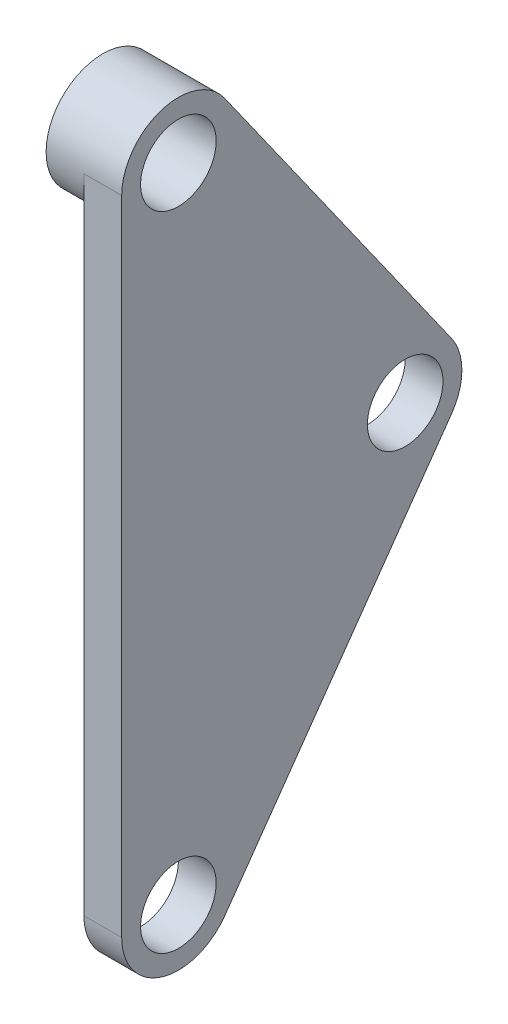
ISO-10303-21;
HEADER;
FILE_DESCRIPTION(('STEP AP214'),'2;1');
FILE_NAME('part.step','',(''),(''),'','','');
FILE_SCHEMA(('AUTOMOTIVE_DESIGN { 1 0 10303 214 1 1 1 1 }'));
ENDSEC;
DATA;
#1=APPLICATION_CONTEXT('core data for automotive mechanical design processes');
#2=APPLICATION_PROTOCOL_DEFINITION('international standard','automotive_design',2000,#1);
#3=PRODUCT_CONTEXT('',#1,'mechanical');
#4=PRODUCT('Part','Part','',(#3));
#5=PRODUCT_RELATED_PRODUCT_CATEGORY('part','',(#4));
#6=PRODUCT_DEFINITION_FORMATION('','',#4);
#7=PRODUCT_DEFINITION_CONTEXT('part definition',#1,'design');
#8=PRODUCT_DEFINITION('design','',#6,#7);
#9=PRODUCT_DEFINITION_SHAPE('','',#8);
#10=(LENGTH_UNIT() NAMED_UNIT(*) SI_UNIT(.MILLI.,.METRE.));
#11=(NAMED_UNIT(*) PLANE_ANGLE_UNIT() SI_UNIT($,.RADIAN.));
#12=(NAMED_UNIT(*) SI_UNIT($,.STERADIAN.) SOLID_ANGLE_UNIT());
#13=UNCERTAINTY_MEASURE_WITH_UNIT(LENGTH_MEASURE(1.E-05),#10,'distance_accuracy_value','');
#14=(GEOMETRIC_REPRESENTATION_CONTEXT(3) GLOBAL_UNCERTAINTY_ASSIGNED_CONTEXT((#13)) GLOBAL_UNIT_ASSIGNED_CONTEXT((#10,
#11,#12)) REPRESENTATION_CONTEXT('',''));
#15=CARTESIAN_POINT('',(0.,0.,0.));
#16=DIRECTION('',(0.,0.,1.));
#17=DIRECTION('',(1.,0.,0.));
#18=AXIS2_PLACEMENT_3D('',#15,#16,#17);
#19=CARTESIAN_POINT('',(2.,2.14575398078673,-3.03981813944787));
#20=DIRECTION('',(0.,0.576683197598655,-0.816967863264762));
#21=DIRECTION('',(0.,0.816967863264762,0.576683197598655));
#22=AXIS2_PLACEMENT_3D('',#19,#20,#21);
#23=PLANE('',#22);
#24=DIRECTION('',(0.,-0.816967863264762,-0.576683197598655));
#25=VECTOR('',#24,1.);
#26=CARTESIAN_POINT('',(0.,2.14575398078673,-3.03981813944787));
#27=LINE('',#26,#25);
#28=CARTESIAN_POINT('',(0.,-1.26995040720403,-5.45090358979429));
#29=VERTEX_POINT('',#28);
#30=CARTESIAN_POINT('',(0.,-18.269950407204,-17.4509035897943));
#31=VERTEX_POINT('',#30);
#32=EDGE_CURVE('E196',#29,#31,#27,.T.);
#33=ORIENTED_EDGE('',*,*,#32,.F.);
#34=DIRECTION('',(-1.,0.,0.));
#35=VECTOR('',#34,1.);
#36=CARTESIAN_POINT('',(2.,-1.26995040720403,-5.45090358979429));
#37=LINE('',#36,#35);
#38=CARTESIAN_POINT('',(2.,-1.26995040720403,-5.45090358979429));
#39=VERTEX_POINT('',#38);
#40=EDGE_CURVE('E211',#39,#29,#37,.T.);
#41=ORIENTED_EDGE('',*,*,#40,.F.);
#42=DIRECTION('',(0.,-0.816967863264762,-0.576683197598655));
#43=VECTOR('',#42,1.);
#44=CARTESIAN_POINT('',(2.,2.14575398078673,-3.03981813944787));
#45=LINE('',#44,#43);
#46=CARTESIAN_POINT('',(2.,-18.269950407204,-17.4509035897943));
#47=VERTEX_POINT('',#46);
#48=EDGE_CURVE('E187',#39,#47,#45,.T.);
#49=ORIENTED_EDGE('',*,*,#48,.T.);
#50=DIRECTION('',(-1.,0.,0.));
#51=VECTOR('',#50,1.);
#52=CARTESIAN_POINT('',(2.,-18.269950407204,-17.4509035897943));
#53=LINE('',#52,#51);
#54=EDGE_CURVE('E115',#47,#31,#53,.T.);
#55=ORIENTED_EDGE('',*,*,#54,.T.);
#56=EDGE_LOOP('',(#33,#41,#49,#55));
#57=FACE_BOUND('',#56,.T.);
#58=ADVANCED_FACE('F104',(#57),#23,.T.);
#59=CARTESIAN_POINT('',(2.,0.,0.));
#60=DIRECTION('',(0.,0.,-1.));
#61=DIRECTION('',(-1.,0.,0.));
#62=AXIS2_PLACEMENT_3D('',#59,#60,#61);
#63=PLANE('',#62);
#64=DIRECTION('',(0.,-1.,0.));
#65=VECTOR('',#64,1.);
#66=CARTESIAN_POINT('',(0.,0.,0.));
#67=LINE('',#66,#65);
#68=CARTESIAN_POINT('',(0.,-3.,0.));
#69=VERTEX_POINT('',#68);
#70=CARTESIAN_POINT('',(0.,-37.,0.));
#71=VERTEX_POINT('',#70);
#72=EDGE_CURVE('E168',#69,#71,#67,.T.);
#73=ORIENTED_EDGE('',*,*,#72,.T.);
#74=DIRECTION('',(-1.,0.,0.));
#75=VECTOR('',#74,1.);
#76=CARTESIAN_POINT('',(2.,-37.,0.));
#77=LINE('',#76,#75);
#78=CARTESIAN_POINT('',(2.,-37.,0.));
#79=VERTEX_POINT('',#78);
#80=EDGE_CURVE('E161',#79,#71,#77,.T.);
#81=ORIENTED_EDGE('',*,*,#80,.F.);
#82=DIRECTION('',(0.,-1.,0.));
#83=VECTOR('',#82,1.);
#84=CARTESIAN_POINT('',(2.,0.,0.));
#85=LINE('',#84,#83);
#86=CARTESIAN_POINT('',(2.,-3.,0.));
#87=VERTEX_POINT('',#86);
#88=EDGE_CURVE('E166',#87,#79,#85,.T.);
#89=ORIENTED_EDGE('',*,*,#88,.F.);
#90=DIRECTION('',(-1.,0.,0.));
#91=VECTOR('',#90,1.);
#92=CARTESIAN_POINT('',(2.,-3.,0.));
#93=LINE('',#92,#91);
#94=EDGE_CURVE('E172',#87,#69,#93,.T.);
#95=ORIENTED_EDGE('',*,*,#94,.T.);
#96=EDGE_LOOP('',(#73,#81,#89,#95));
#97=FACE_BOUND('',#96,.T.);
#98=ADVANCED_FACE('F163',(#97),#63,.F.);
#99=CARTESIAN_POINT('',(2.,-15.4482943964911,-21.8850837283624));
#100=DIRECTION('',(0.,-0.576683197598655,-0.816967863264762));
#101=DIRECTION('',(0.,0.816967863264762,-0.576683197598655));
#102=AXIS2_PLACEMENT_3D('',#99,#100,#101);
#103=PLANE('',#102);
#104=DIRECTION('',(0.,-0.816967863264762,0.576683197598655));
#105=VECTOR('',#104,1.);
#106=CARTESIAN_POINT('',(0.,-15.4482943964911,-21.8850837283624));
#107=LINE('',#106,#105);
#108=CARTESIAN_POINT('',(0.,-21.730049592796,-17.4509035897943));
#109=VERTEX_POINT('',#108);
#110=CARTESIAN_POINT('',(0.,-38.730049592796,-5.45090358979429));
#111=VERTEX_POINT('',#110);
#112=EDGE_CURVE('E193',#109,#111,#107,.T.);
#113=ORIENTED_EDGE('',*,*,#112,.F.);
#114=DIRECTION('',(-1.,0.,0.));
#115=VECTOR('',#114,1.);
#116=CARTESIAN_POINT('',(2.,-21.730049592796,-17.4509035897943));
#117=LINE('',#116,#115);
#118=CARTESIAN_POINT('',(2.,-21.730049592796,-17.4509035897943));
#119=VERTEX_POINT('',#118);
#120=EDGE_CURVE('E124',#119,#109,#117,.T.);
#121=ORIENTED_EDGE('',*,*,#120,.F.);
#122=DIRECTION('',(0.,-0.816967863264762,0.576683197598655));
#123=VECTOR('',#122,1.);
#124=CARTESIAN_POINT('',(2.,-15.4482943964911,-21.8850837283624));
#125=LINE('',#124,#123);
#126=CARTESIAN_POINT('',(2.,-38.730049592796,-5.45090358979429));
#127=VERTEX_POINT('',#126);
#128=EDGE_CURVE('E186',#119,#127,#125,.T.);
#129=ORIENTED_EDGE('',*,*,#128,.T.);
#130=DIRECTION('',(-1.,0.,0.));
#131=VECTOR('',#130,1.);
#132=CARTESIAN_POINT('',(2.,-38.730049592796,-5.45090358979429));
#133=LINE('',#132,#131);
#134=EDGE_CURVE('E141',#127,#111,#133,.T.);
#135=ORIENTED_EDGE('',*,*,#134,.T.);
#136=EDGE_LOOP('',(#113,#121,#129,#135));
#137=FACE_BOUND('',#136,.T.);
#138=ADVANCED_FACE('F229',(#137),#103,.T.);
#139=CARTESIAN_POINT('',(0.,0.,0.));
#140=DIRECTION('',(1.,0.,0.));
#141=DIRECTION('',(0.,0.,-1.));
#142=AXIS2_PLACEMENT_3D('',#139,#140,#141);
#143=PLANE('',#142);
#144=CARTESIAN_POINT('',(0.,-20.,-15.));
#145=DIRECTION('',(1.,0.,0.));
#146=DIRECTION('',(0.,0.,-1.));
#147=AXIS2_PLACEMENT_3D('',#144,#145,#146);
#148=CIRCLE('',#147,2.);
#149=CARTESIAN_POINT('',(0.,-20.,-17.));
#150=VERTEX_POINT('',#149);
#151=EDGE_CURVE('E301',#150,#150,#148,.F.);
#152=ORIENTED_EDGE('',*,*,#151,.F.);
#153=EDGE_LOOP('',(#152));
#154=FACE_BOUND('',#153,.T.);
#155=CARTESIAN_POINT('',(0.,-37.,-3.));
#156=DIRECTION('',(1.,0.,0.));
#157=DIRECTION('',(0.,0.,-1.));
#158=AXIS2_PLACEMENT_3D('',#155,#156,#157);
#159=CIRCLE('',#158,2.);
#160=CARTESIAN_POINT('',(0.,-37.,-5.));
#161=VERTEX_POINT('',#160);
#162=EDGE_CURVE('E289',#161,#161,#159,.F.);
#163=ORIENTED_EDGE('',*,*,#162,.F.);
#164=EDGE_LOOP('',(#163));
#165=FACE_BOUND('',#164,.T.);
#166=ORIENTED_EDGE('',*,*,#72,.F.);
#167=CARTESIAN_POINT('',(0.,-3.,-3.));
#168=DIRECTION('',(1.,0.,0.));
#169=DIRECTION('',(0.,0.,-1.));
#170=AXIS2_PLACEMENT_3D('',#167,#168,#169);
#171=CIRCLE('',#170,3.);
#172=EDGE_CURVE('E12',#69,#29,#171,.T.);
#173=ORIENTED_EDGE('',*,*,#172,.T.);
#174=ORIENTED_EDGE('',*,*,#32,.T.);
#175=CARTESIAN_POINT('',(0.,-20.,-15.));
#176=DIRECTION('',(1.,0.,0.));
#177=DIRECTION('',(0.,0.,-1.));
#178=AXIS2_PLACEMENT_3D('',#175,#176,#177);
#179=CIRCLE('',#178,3.);
#180=EDGE_CURVE('E179',#109,#31,#179,.T.);
#181=ORIENTED_EDGE('',*,*,#180,.F.);
#182=ORIENTED_EDGE('',*,*,#112,.T.);
#183=CARTESIAN_POINT('',(0.,-37.,-3.));
#184=DIRECTION('',(1.,0.,0.));
#185=DIRECTION('',(0.,0.,-1.));
#186=AXIS2_PLACEMENT_3D('',#183,#184,#185);
#187=CIRCLE('',#186,3.);
#188=EDGE_CURVE('E108',#71,#111,#187,.T.);
#189=ORIENTED_EDGE('',*,*,#188,.F.);
#190=EDGE_LOOP('',(#166,#173,#174,#181,#182,#189));
#191=FACE_BOUND('',#190,.T.);
#192=ADVANCED_FACE('F226',(#154,#165,#191),#143,.F.);
#193=CARTESIAN_POINT('',(2.,0.,0.));
#194=DIRECTION('',(1.,0.,0.));
#195=DIRECTION('',(0.,0.,-1.));
#196=AXIS2_PLACEMENT_3D('',#193,#194,#195);
#197=PLANE('',#196);
#198=CARTESIAN_POINT('',(2.,-3.,-3.));
#199=DIRECTION('',(1.,0.,0.));
#200=DIRECTION('',(0.,0.,-1.));
#201=AXIS2_PLACEMENT_3D('',#198,#199,#200);
#202=CIRCLE('',#201,2.);
#203=CARTESIAN_POINT('',(2.,-3.,-5.));
#204=VERTEX_POINT('',#203);
#205=EDGE_CURVE('E280',#204,#204,#202,.T.);
#206=ORIENTED_EDGE('',*,*,#205,.F.);
#207=EDGE_LOOP('',(#206));
#208=FACE_BOUND('',#207,.T.);
#209=CARTESIAN_POINT('',(2.,-20.,-15.));
#210=DIRECTION('',(1.,0.,0.));
#211=DIRECTION('',(0.,0.,-1.));
#212=AXIS2_PLACEMENT_3D('',#209,#210,#211);
#213=CIRCLE('',#212,2.);
#214=CARTESIAN_POINT('',(2.,-20.,-17.));
#215=VERTEX_POINT('',#214);
#216=EDGE_CURVE('E285',#215,#215,#213,.T.);
#217=ORIENTED_EDGE('',*,*,#216,.F.);
#218=EDGE_LOOP('',(#217));
#219=FACE_BOUND('',#218,.T.);
#220=CARTESIAN_POINT('',(2.,-37.,-3.));
#221=DIRECTION('',(1.,0.,0.));
#222=DIRECTION('',(0.,0.,-1.));
#223=AXIS2_PLACEMENT_3D('',#220,#221,#222);
#224=CIRCLE('',#223,2.);
#225=CARTESIAN_POINT('',(2.,-37.,-5.));
#226=VERTEX_POINT('',#225);
#227=EDGE_CURVE('E292',#226,#226,#224,.T.);
#228=ORIENTED_EDGE('',*,*,#227,.F.);
#229=EDGE_LOOP('',(#228));
#230=FACE_BOUND('',#229,.T.);
#231=ORIENTED_EDGE('',*,*,#128,.F.);
#232=CARTESIAN_POINT('',(2.,-20.,-15.));
#233=DIRECTION('',(1.,0.,0.));
#234=DIRECTION('',(0.,0.,-1.));
#235=AXIS2_PLACEMENT_3D('',#232,#233,#234);
#236=CIRCLE('',#235,3.);
#237=EDGE_CURVE('E219',#119,#47,#236,.T.);
#238=ORIENTED_EDGE('',*,*,#237,.T.);
#239=ORIENTED_EDGE('',*,*,#48,.F.);
#240=CARTESIAN_POINT('',(2.,-3.,-3.));
#241=DIRECTION('',(1.,0.,0.));
#242=DIRECTION('',(0.,0.,-1.));
#243=AXIS2_PLACEMENT_3D('',#240,#241,#242);
#244=CIRCLE('',#243,3.);
#245=EDGE_CURVE('E184',#39,#87,#244,.T.);
#246=ORIENTED_EDGE('',*,*,#245,.T.);
#247=ORIENTED_EDGE('',*,*,#88,.T.);
#248=CARTESIAN_POINT('',(2.,-37.,-3.));
#249=DIRECTION('',(1.,0.,0.));
#250=DIRECTION('',(0.,0.,-1.));
#251=AXIS2_PLACEMENT_3D('',#248,#249,#250);
#252=CIRCLE('',#251,3.);
#253=EDGE_CURVE('E175',#79,#127,#252,.T.);
#254=ORIENTED_EDGE('',*,*,#253,.T.);
#255=EDGE_LOOP('',(#231,#238,#239,#246,#247,#254));
#256=FACE_BOUND('',#255,.T.);
#257=ADVANCED_FACE('F181',(#208,#219,#230,#256),#197,.T.);
#258=CARTESIAN_POINT('',(2.,-37.,-3.));
#259=DIRECTION('',(-1.,0.,0.));
#260=DIRECTION('',(0.,0.,1.));
#261=AXIS2_PLACEMENT_3D('',#258,#259,#260);
#262=CYLINDRICAL_SURFACE('',#261,3.);
#263=ORIENTED_EDGE('',*,*,#253,.F.);
#264=ORIENTED_EDGE('',*,*,#80,.T.);
#265=ORIENTED_EDGE('',*,*,#188,.T.);
#266=ORIENTED_EDGE('',*,*,#134,.F.);
#267=EDGE_LOOP('',(#263,#264,#265,#266));
#268=FACE_BOUND('',#267,.T.);
#269=ADVANCED_FACE('F106',(#268),#262,.T.);
#270=CARTESIAN_POINT('',(2.,-20.,-15.));
#271=DIRECTION('',(-1.,0.,0.));
#272=DIRECTION('',(0.,0.,1.));
#273=AXIS2_PLACEMENT_3D('',#270,#271,#272);
#274=CYLINDRICAL_SURFACE('',#273,3.);
#275=ORIENTED_EDGE('',*,*,#180,.T.);
#276=ORIENTED_EDGE('',*,*,#54,.F.);
#277=ORIENTED_EDGE('',*,*,#237,.F.);
#278=ORIENTED_EDGE('',*,*,#120,.T.);
#279=EDGE_LOOP('',(#275,#276,#277,#278));
#280=FACE_BOUND('',#279,.T.);
#281=ADVANCED_FACE('F223',(#280),#274,.T.);
#282=CARTESIAN_POINT('',(2.,-3.,-3.));
#283=DIRECTION('',(-1.,0.,0.));
#284=DIRECTION('',(0.,0.,1.));
#285=AXIS2_PLACEMENT_3D('',#282,#283,#284);
#286=CYLINDRICAL_SURFACE('',#285,3.);
#287=ORIENTED_EDGE('',*,*,#245,.F.);
#288=ORIENTED_EDGE('',*,*,#40,.T.);
#289=ORIENTED_EDGE('',*,*,#172,.F.);
#290=ORIENTED_EDGE('',*,*,#94,.F.);
#291=EDGE_LOOP('',(#287,#288,#289,#290));
#292=FACE_BOUND('',#291,.T.);
#293=CARTESIAN_POINT('',(-2.,-3.,-3.));
#294=DIRECTION('',(1.,0.,0.));
#295=DIRECTION('',(0.,0.,-1.));
#296=AXIS2_PLACEMENT_3D('',#293,#294,#295);
#297=CIRCLE('',#296,3.);
#298=CARTESIAN_POINT('',(-2.,-3.,-6.));
#299=VERTEX_POINT('',#298);
#300=EDGE_CURVE('E305',#299,#299,#297,.T.);
#301=ORIENTED_EDGE('',*,*,#300,.T.);
#302=EDGE_LOOP('',(#301));
#303=FACE_BOUND('',#302,.T.);
#304=ADVANCED_FACE('F244',(#292,#303),#286,.T.);
#305=CARTESIAN_POINT('',(-2.,-3.,-3.));
#306=DIRECTION('',(1.,0.,0.));
#307=DIRECTION('',(0.,0.,-1.));
#308=AXIS2_PLACEMENT_3D('',#305,#306,#307);
#309=PLANE('',#308);
#310=CARTESIAN_POINT('',(-2.,-3.,-3.));
#311=DIRECTION('',(1.,0.,0.));
#312=DIRECTION('',(0.,0.,-1.));
#313=AXIS2_PLACEMENT_3D('',#310,#311,#312);
#314=CIRCLE('',#313,2.);
#315=CARTESIAN_POINT('',(-2.,-3.,-5.));
#316=VERTEX_POINT('',#315);
#317=EDGE_CURVE('E283',#316,#316,#314,.T.);
#318=ORIENTED_EDGE('',*,*,#317,.T.);
#319=EDGE_LOOP('',(#318));
#320=FACE_BOUND('',#319,.T.);
#321=ORIENTED_EDGE('',*,*,#300,.F.);
#322=EDGE_LOOP('',(#321));
#323=FACE_BOUND('',#322,.T.);
#324=ADVANCED_FACE('F246',(#320,#323),#309,.F.);
#325=CARTESIAN_POINT('',(2.,-3.,-3.));
#326=DIRECTION('',(-1.,0.,0.));
#327=DIRECTION('',(0.,0.,1.));
#328=AXIS2_PLACEMENT_3D('',#325,#326,#327);
#329=CYLINDRICAL_SURFACE('',#328,2.);
#330=ORIENTED_EDGE('',*,*,#205,.T.);
#331=EDGE_LOOP('',(#330));
#332=FACE_BOUND('',#331,.T.);
#333=ORIENTED_EDGE('',*,*,#317,.F.);
#334=EDGE_LOOP('',(#333));
#335=FACE_BOUND('',#334,.T.);
#336=ADVANCED_FACE('F264',(#332,#335),#329,.F.);
#337=CARTESIAN_POINT('',(2.,-37.,-3.));
#338=DIRECTION('',(-1.,0.,0.));
#339=DIRECTION('',(0.,0.,1.));
#340=AXIS2_PLACEMENT_3D('',#337,#338,#339);
#341=CYLINDRICAL_SURFACE('',#340,2.);
#342=ORIENTED_EDGE('',*,*,#227,.T.);
#343=EDGE_LOOP('',(#342));
#344=FACE_BOUND('',#343,.T.);
#345=ORIENTED_EDGE('',*,*,#162,.T.);
#346=EDGE_LOOP('',(#345));
#347=FACE_BOUND('',#346,.T.);
#348=ADVANCED_FACE('F266',(#344,#347),#341,.F.);
#349=CARTESIAN_POINT('',(2.,-20.,-15.));
#350=DIRECTION('',(-1.,0.,0.));
#351=DIRECTION('',(0.,0.,1.));
#352=AXIS2_PLACEMENT_3D('',#349,#350,#351);
#353=CYLINDRICAL_SURFACE('',#352,2.);
#354=ORIENTED_EDGE('',*,*,#216,.T.);
#355=EDGE_LOOP('',(#354));
#356=FACE_BOUND('',#355,.T.);
#357=ORIENTED_EDGE('',*,*,#151,.T.);
#358=EDGE_LOOP('',(#357));
#359=FACE_BOUND('',#358,.T.);
#360=ADVANCED_FACE('F269',(#356,#359),#353,.F.);
#361=CLOSED_SHELL('',(#58,#98,#138,#192,#257,#269,#281,#304,#324,#336,#348,#360));
#362=MANIFOLD_SOLID_BREP('B2',#361);
#363=ADVANCED_BREP_SHAPE_REPRESENTATION('',(#18,#362),#14);
#364=SHAPE_DEFINITION_REPRESENTATION(#9,#363);
ENDSEC;
END-ISO-10303-21;
